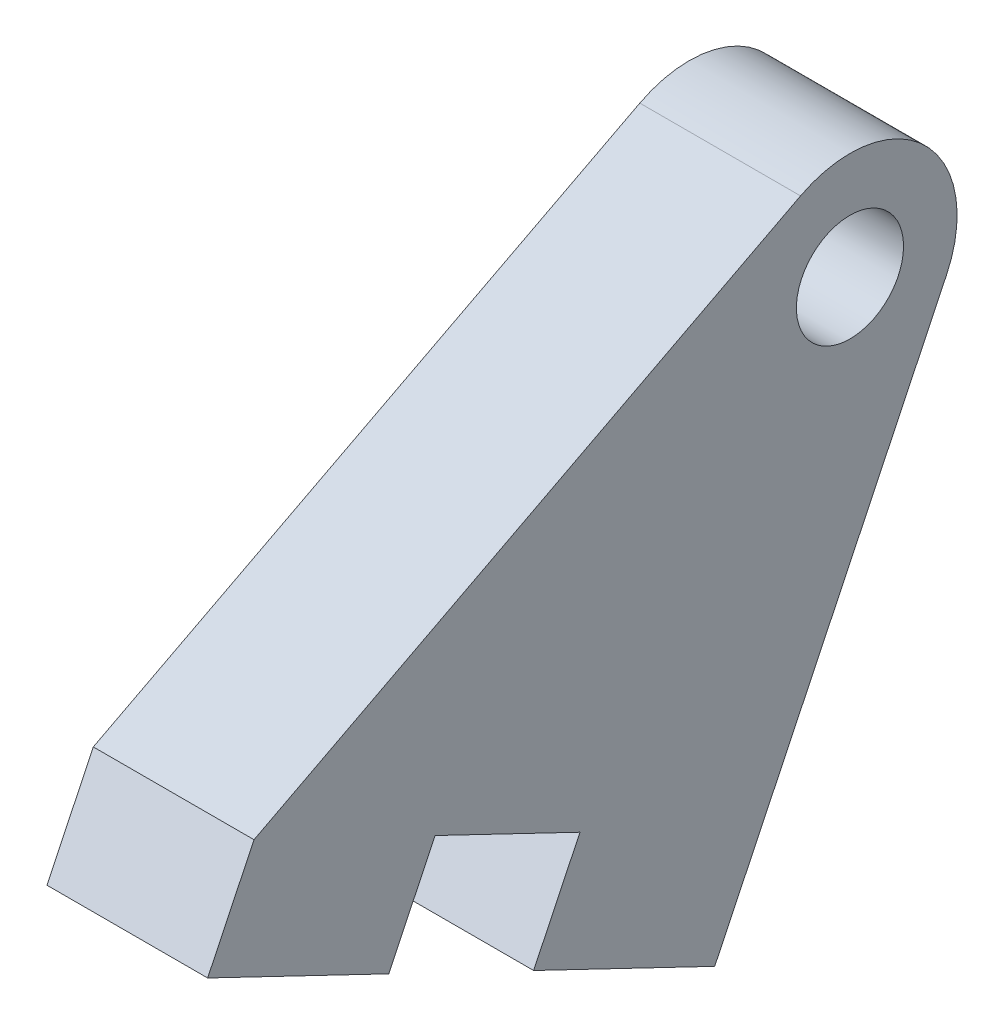
ISO-10303-21;
HEADER;
FILE_DESCRIPTION(('STEP AP214'),'2;1');
FILE_NAME('part.step','',(''),(''),'','','');
FILE_SCHEMA(('AUTOMOTIVE_DESIGN { 1 0 10303 214 1 1 1 1 }'));
ENDSEC;
DATA;
#1=APPLICATION_CONTEXT('core data for automotive mechanical design processes');
#2=APPLICATION_PROTOCOL_DEFINITION('international standard','automotive_design',2000,#1);
#3=PRODUCT_CONTEXT('',#1,'mechanical');
#4=PRODUCT('Part','Part','',(#3));
#5=PRODUCT_RELATED_PRODUCT_CATEGORY('part','',(#4));
#6=PRODUCT_DEFINITION_FORMATION('','',#4);
#7=PRODUCT_DEFINITION_CONTEXT('part definition',#1,'design');
#8=PRODUCT_DEFINITION('design','',#6,#7);
#9=PRODUCT_DEFINITION_SHAPE('','',#8);
#10=(LENGTH_UNIT() NAMED_UNIT(*) SI_UNIT(.MILLI.,.METRE.));
#11=(NAMED_UNIT(*) PLANE_ANGLE_UNIT() SI_UNIT($,.RADIAN.));
#12=(NAMED_UNIT(*) SI_UNIT($,.STERADIAN.) SOLID_ANGLE_UNIT());
#13=UNCERTAINTY_MEASURE_WITH_UNIT(LENGTH_MEASURE(1.E-05),#10,'distance_accuracy_value','');
#14=(GEOMETRIC_REPRESENTATION_CONTEXT(3) GLOBAL_UNCERTAINTY_ASSIGNED_CONTEXT((#13)) GLOBAL_UNIT_ASSIGNED_CONTEXT((#10,
#11,#12)) REPRESENTATION_CONTEXT('',''));
#15=CARTESIAN_POINT('',(0.,0.,0.));
#16=DIRECTION('',(0.,0.,1.));
#17=DIRECTION('',(1.,0.,0.));
#18=AXIS2_PLACEMENT_3D('',#15,#16,#17);
#19=CARTESIAN_POINT('',(1.5,46.5483244603981,24.2151695044081));
#20=DIRECTION('',(0.,-0.887138460295416,-0.461503361054585));
#21=DIRECTION('',(0.,0.461503361054585,-0.887138460295416));
#22=AXIS2_PLACEMENT_3D('',#19,#20,#21);
#23=PLANE('',#22);
#24=DIRECTION('',(0.,-0.461503361054585,0.887138460295416));
#25=VECTOR('',#24,1.);
#26=CARTESIAN_POINT('',(0.,46.5483244603981,24.2151695044081));
#27=LINE('',#26,#25);
#28=CARTESIAN_POINT('',(0.,8.87863013767206,96.6268515014751));
#29=VERTEX_POINT('',#28);
#30=CARTESIAN_POINT('',(0.,6.2249858116082,101.727897648174));
#31=VERTEX_POINT('',#30);
#32=EDGE_CURVE('E141',#29,#31,#27,.T.);
#33=ORIENTED_EDGE('',*,*,#32,.T.);
#34=DIRECTION('',(-1.,0.,0.));
#35=VECTOR('',#34,1.);
#36=CARTESIAN_POINT('',(1.5,6.2249858116082,101.727897648174));
#37=LINE('',#36,#35);
#38=CARTESIAN_POINT('',(1.5,6.2249858116082,101.727897648174));
#39=VERTEX_POINT('',#38);
#40=EDGE_CURVE('E11',#39,#31,#37,.T.);
#41=ORIENTED_EDGE('',*,*,#40,.F.);
#42=DIRECTION('',(0.,-0.461503361054585,0.887138460295416));
#43=VECTOR('',#42,1.);
#44=CARTESIAN_POINT('',(1.5,46.5483244603981,24.2151695044081));
#45=LINE('',#44,#43);
#46=CARTESIAN_POINT('',(1.5,8.87863013767206,96.6268515014751));
#47=VERTEX_POINT('',#46);
#48=EDGE_CURVE('E160',#47,#39,#45,.T.);
#49=ORIENTED_EDGE('',*,*,#48,.F.);
#50=DIRECTION('',(-1.,0.,0.));
#51=VECTOR('',#50,1.);
#52=CARTESIAN_POINT('',(1.5,8.87863013767206,96.6268515014751));
#53=LINE('',#52,#51);
#54=EDGE_CURVE('E140',#47,#29,#53,.T.);
#55=ORIENTED_EDGE('',*,*,#54,.T.);
#56=EDGE_LOOP('',(#33,#41,#49,#55));
#57=FACE_BOUND('',#56,.T.);
#58=ADVANCED_FACE('F35',(#57),#23,.F.);
#59=CARTESIAN_POINT('',(1.5,40.8573538879818,85.1006889069874));
#60=DIRECTION('',(0.,-0.432808751603578,-0.90148576502092));
#61=DIRECTION('',(0.,0.90148576502092,-0.432808751603578));
#62=AXIS2_PLACEMENT_3D('',#59,#60,#61);
#63=PLANE('',#62);
#64=DIRECTION('',(0.,-0.90148576502092,0.432808751603578));
#65=VECTOR('',#64,1.);
#66=CARTESIAN_POINT('',(0.,40.8573538879818,85.1006889069874));
#67=LINE('',#66,#65);
#68=CARTESIAN_POINT('',(0.,5.3235000465873,102.160706399777));
#69=VERTEX_POINT('',#68);
#70=EDGE_CURVE('E144',#31,#69,#67,.T.);
#71=ORIENTED_EDGE('',*,*,#70,.T.);
#72=DIRECTION('',(-1.,0.,0.));
#73=VECTOR('',#72,1.);
#74=CARTESIAN_POINT('',(1.5,5.3235000465873,102.160706399777));
#75=LINE('',#74,#73);
#76=CARTESIAN_POINT('',(1.5,5.3235000465873,102.160706399777));
#77=VERTEX_POINT('',#76);
#78=EDGE_CURVE('E43',#77,#69,#75,.T.);
#79=ORIENTED_EDGE('',*,*,#78,.F.);
#80=DIRECTION('',(0.,-0.90148576502092,0.432808751603578));
#81=VECTOR('',#80,1.);
#82=CARTESIAN_POINT('',(1.5,40.8573538879818,85.1006889069874));
#83=LINE('',#82,#81);
#84=EDGE_CURVE('E97',#39,#77,#83,.T.);
#85=ORIENTED_EDGE('',*,*,#84,.F.);
#86=ORIENTED_EDGE('',*,*,#40,.T.);
#87=EDGE_LOOP('',(#71,#79,#85,#86));
#88=FACE_BOUND('',#87,.T.);
#89=ADVANCED_FACE('F204',(#88),#63,.F.);
#90=CARTESIAN_POINT('',(1.5,-35.533853841395,17.0600174927904));
#91=DIRECTION('',(0.,0.901485765020916,-0.432808751603584));
#92=DIRECTION('',(0.,0.432808751603584,0.901485765020916));
#93=AXIS2_PLACEMENT_3D('',#90,#91,#92);
#94=PLANE('',#93);
#95=DIRECTION('',(0.,-0.432808751603584,-0.901485765020916));
#96=VECTOR('',#95,1.);
#97=CARTESIAN_POINT('',(0.,-35.533853841395,17.0600174927904));
#98=LINE('',#97,#96);
#99=CARTESIAN_POINT('',(0.,4.51198363733057,100.470420590363));
#100=VERTEX_POINT('',#99);
#101=EDGE_CURVE('E146',#69,#100,#98,.T.);
#102=ORIENTED_EDGE('',*,*,#101,.T.);
#103=DIRECTION('',(-1.,0.,0.));
#104=VECTOR('',#103,1.);
#105=CARTESIAN_POINT('',(1.5,4.51198363733057,100.470420590363));
#106=LINE('',#105,#104);
#107=CARTESIAN_POINT('',(1.5,4.51198363733057,100.470420590363));
#108=VERTEX_POINT('',#107);
#109=EDGE_CURVE('E170',#108,#100,#106,.T.);
#110=ORIENTED_EDGE('',*,*,#109,.F.);
#111=DIRECTION('',(0.,-0.432808751603584,-0.901485765020916));
#112=VECTOR('',#111,1.);
#113=CARTESIAN_POINT('',(1.5,-35.533853841395,17.0600174927904));
#114=LINE('',#113,#112);
#115=EDGE_CURVE('E178',#77,#108,#114,.T.);
#116=ORIENTED_EDGE('',*,*,#115,.F.);
#117=ORIENTED_EDGE('',*,*,#78,.T.);
#118=EDGE_LOOP('',(#102,#110,#116,#117));
#119=FACE_BOUND('',#118,.T.);
#120=ADVANCED_FACE('F176',(#119),#94,.F.);
#121=CARTESIAN_POINT('',(1.5,40.0458374787251,83.4104030975731));
#122=DIRECTION('',(0.,0.432808751603579,0.901485765020919));
#123=DIRECTION('',(0.,-0.901485765020919,0.432808751603579));
#124=AXIS2_PLACEMENT_3D('',#121,#122,#123);
#125=PLANE('',#124);
#126=DIRECTION('',(0.,0.901485765020919,-0.432808751603579));
#127=VECTOR('',#126,1.);
#128=CARTESIAN_POINT('',(0.,40.0458374787251,83.4104030975731));
#129=LINE('',#128,#127);
#130=CARTESIAN_POINT('',(0.,5.4134694023515,100.03761183876));
#131=VERTEX_POINT('',#130);
#132=EDGE_CURVE('E148',#100,#131,#129,.T.);
#133=ORIENTED_EDGE('',*,*,#132,.T.);
#134=DIRECTION('',(-1.,0.,0.));
#135=VECTOR('',#134,1.);
#136=CARTESIAN_POINT('',(1.5,5.4134694023515,100.03761183876));
#137=LINE('',#136,#135);
#138=CARTESIAN_POINT('',(1.5,5.4134694023515,100.03761183876));
#139=VERTEX_POINT('',#138);
#140=EDGE_CURVE('E167',#139,#131,#137,.T.);
#141=ORIENTED_EDGE('',*,*,#140,.F.);
#142=DIRECTION('',(0.,0.901485765020919,-0.432808751603579));
#143=VECTOR('',#142,1.);
#144=CARTESIAN_POINT('',(1.5,40.0458374787251,83.4104030975731));
#145=LINE('',#144,#143);
#146=EDGE_CURVE('E195',#108,#139,#145,.T.);
#147=ORIENTED_EDGE('',*,*,#146,.F.);
#148=ORIENTED_EDGE('',*,*,#109,.T.);
#149=EDGE_LOOP('',(#133,#141,#147,#148));
#150=FACE_BOUND('',#149,.T.);
#151=ADVANCED_FACE('F188',(#150),#125,.F.);
#152=CARTESIAN_POINT('',(1.5,-34.6323680763742,16.627208741187));
#153=DIRECTION('',(0.,0.901485765020915,-0.432808751603586));
#154=DIRECTION('',(0.,0.432808751603586,0.901485765020916));
#155=AXIS2_PLACEMENT_3D('',#152,#153,#154);
#156=PLANE('',#155);
#157=DIRECTION('',(0.,-0.432808751603586,-0.901485765020916));
#158=VECTOR('',#157,1.);
#159=CARTESIAN_POINT('',(0.,-34.6323680763742,16.627208741187));
#160=LINE('',#159,#158);
#161=CARTESIAN_POINT('',(0.,4.7642562749461,98.6853831912281));
#162=VERTEX_POINT('',#161);
#163=EDGE_CURVE('E150',#131,#162,#160,.T.);
#164=ORIENTED_EDGE('',*,*,#163,.T.);
#165=DIRECTION('',(-1.,0.,0.));
#166=VECTOR('',#165,1.);
#167=CARTESIAN_POINT('',(1.5,4.7642562749461,98.6853831912281));
#168=LINE('',#167,#166);
#169=CARTESIAN_POINT('',(1.5,4.7642562749461,98.6853831912281));
#170=VERTEX_POINT('',#169);
#171=EDGE_CURVE('E164',#170,#162,#168,.T.);
#172=ORIENTED_EDGE('',*,*,#171,.F.);
#173=DIRECTION('',(0.,-0.432808751603586,-0.901485765020916));
#174=VECTOR('',#173,1.);
#175=CARTESIAN_POINT('',(1.5,-34.6323680763742,16.627208741187));
#176=LINE('',#175,#174);
#177=EDGE_CURVE('E194',#139,#170,#176,.T.);
#178=ORIENTED_EDGE('',*,*,#177,.F.);
#179=ORIENTED_EDGE('',*,*,#140,.T.);
#180=EDGE_LOOP('',(#164,#172,#178,#179));
#181=FACE_BOUND('',#180,.T.);
#182=ADVANCED_FACE('F192',(#181),#156,.F.);
#183=CARTESIAN_POINT('',(1.5,39.3966243513197,82.0581744500419));
#184=DIRECTION('',(0.,-0.432808751603577,-0.90148576502092));
#185=DIRECTION('',(0.,0.90148576502092,-0.432808751603578));
#186=AXIS2_PLACEMENT_3D('',#183,#184,#185);
#187=PLANE('',#186);
#188=DIRECTION('',(0.,-0.90148576502092,0.432808751603577));
#189=VECTOR('',#188,1.);
#190=CARTESIAN_POINT('',(0.,39.3966243513197,82.0581744500419));
#191=LINE('',#190,#189);
#192=CARTESIAN_POINT('',(0.,3.8627705099252,99.1181919428317));
#193=VERTEX_POINT('',#192);
#194=EDGE_CURVE('E152',#162,#193,#191,.T.);
#195=ORIENTED_EDGE('',*,*,#194,.T.);
#196=DIRECTION('',(-1.,0.,0.));
#197=VECTOR('',#196,1.);
#198=CARTESIAN_POINT('',(1.5,3.8627705099252,99.1181919428317));
#199=LINE('',#198,#197);
#200=CARTESIAN_POINT('',(1.5,3.8627705099252,99.1181919428317));
#201=VERTEX_POINT('',#200);
#202=EDGE_CURVE('E129',#201,#193,#199,.T.);
#203=ORIENTED_EDGE('',*,*,#202,.F.);
#204=DIRECTION('',(0.,-0.90148576502092,0.432808751603577));
#205=VECTOR('',#204,1.);
#206=CARTESIAN_POINT('',(1.5,39.3966243513197,82.0581744500419));
#207=LINE('',#206,#205);
#208=EDGE_CURVE('E120',#170,#201,#207,.T.);
#209=ORIENTED_EDGE('',*,*,#208,.F.);
#210=ORIENTED_EDGE('',*,*,#171,.T.);
#211=EDGE_LOOP('',(#195,#203,#209,#210));
#212=FACE_BOUND('',#211,.T.);
#213=ADVANCED_FACE('F216',(#212),#187,.F.);
#214=CARTESIAN_POINT('',(1.5,-35.533853841395,17.0600174927904));
#215=DIRECTION('',(0.,0.901485765020916,-0.432808751603584));
#216=DIRECTION('',(0.,0.432808751603584,0.901485765020916));
#217=AXIS2_PLACEMENT_3D('',#214,#215,#216);
#218=PLANE('',#217);
#219=DIRECTION('',(0.,-0.432808751603584,-0.901485765020916));
#220=VECTOR('',#219,1.);
#221=CARTESIAN_POINT('',(0.,-35.533853841395,17.0600174927904));
#222=LINE('',#221,#220);
#223=CARTESIAN_POINT('',(0.,3.05125410066848,97.4279061334175));
#224=VERTEX_POINT('',#223);
#225=EDGE_CURVE('E128',#193,#224,#222,.T.);
#226=ORIENTED_EDGE('',*,*,#225,.T.);
#227=DIRECTION('',(-1.,0.,0.));
#228=VECTOR('',#227,1.);
#229=CARTESIAN_POINT('',(1.5,3.05125410066848,97.4279061334175));
#230=LINE('',#229,#228);
#231=CARTESIAN_POINT('',(1.5,3.05125410066848,97.4279061334175));
#232=VERTEX_POINT('',#231);
#233=EDGE_CURVE('E125',#232,#224,#230,.T.);
#234=ORIENTED_EDGE('',*,*,#233,.F.);
#235=DIRECTION('',(0.,-0.432808751603584,-0.901485765020916));
#236=VECTOR('',#235,1.);
#237=CARTESIAN_POINT('',(1.5,-35.533853841395,17.0600174927904));
#238=LINE('',#237,#236);
#239=EDGE_CURVE('E113',#201,#232,#238,.T.);
#240=ORIENTED_EDGE('',*,*,#239,.F.);
#241=ORIENTED_EDGE('',*,*,#202,.T.);
#242=EDGE_LOOP('',(#226,#234,#240,#241));
#243=FACE_BOUND('',#242,.T.);
#244=ADVANCED_FACE('F126',(#243),#218,.F.);
#245=CARTESIAN_POINT('',(1.5,38.5851079420635,80.367888640627));
#246=DIRECTION('',(0.,0.432808751603586,0.901485765020915));
#247=DIRECTION('',(0.,-0.901485765020916,0.432808751603586));
#248=AXIS2_PLACEMENT_3D('',#245,#246,#247);
#249=PLANE('',#248);
#250=DIRECTION('',(0.,0.901485765020916,-0.432808751603586));
#251=VECTOR('',#250,1.);
#252=CARTESIAN_POINT('',(0.,38.5851079420635,80.367888640627));
#253=LINE('',#252,#251);
#254=CARTESIAN_POINT('',(0.,7.55868292577306,95.2638623753996));
#255=VERTEX_POINT('',#254);
#256=EDGE_CURVE('E83',#224,#255,#253,.T.);
#257=ORIENTED_EDGE('',*,*,#256,.T.);
#258=DIRECTION('',(-1.,0.,0.));
#259=VECTOR('',#258,1.);
#260=CARTESIAN_POINT('',(1.5,7.55868292577306,95.2638623753996));
#261=LINE('',#260,#259);
#262=CARTESIAN_POINT('',(1.5,7.55868292577306,95.2638623753996));
#263=VERTEX_POINT('',#262);
#264=EDGE_CURVE('E130',#263,#255,#261,.T.);
#265=ORIENTED_EDGE('',*,*,#264,.F.);
#266=DIRECTION('',(0.,0.901485765020916,-0.432808751603586));
#267=VECTOR('',#266,1.);
#268=CARTESIAN_POINT('',(1.5,38.5851079420635,80.367888640627));
#269=LINE('',#268,#267);
#270=EDGE_CURVE('E118',#232,#263,#269,.T.);
#271=ORIENTED_EDGE('',*,*,#270,.F.);
#272=ORIENTED_EDGE('',*,*,#233,.T.);
#273=EDGE_LOOP('',(#257,#265,#271,#272));
#274=FACE_BOUND('',#273,.T.);
#275=ADVANCED_FACE('F132',(#274),#249,.F.);
#276=CARTESIAN_POINT('',(1.5,7.99149167737665,96.1653481404205));
#277=DIRECTION('',(-1.,0.,0.));
#278=DIRECTION('',(0.,0.,1.));
#279=AXIS2_PLACEMENT_3D('',#276,#277,#278);
#280=CYLINDRICAL_SURFACE('',#279,0.999999999999998);
#281=CARTESIAN_POINT('',(0.,7.99149167737665,96.1653481404205));
#282=DIRECTION('',(1.,0.,0.));
#283=DIRECTION('',(0.,0.,-1.));
#284=AXIS2_PLACEMENT_3D('',#281,#282,#283);
#285=CIRCLE('',#284,0.999999999999998);
#286=EDGE_CURVE('E89',#255,#29,#285,.T.);
#287=ORIENTED_EDGE('',*,*,#286,.T.);
#288=ORIENTED_EDGE('',*,*,#54,.F.);
#289=CARTESIAN_POINT('',(1.5,7.99149167737665,96.1653481404205));
#290=DIRECTION('',(1.,0.,0.));
#291=DIRECTION('',(0.,0.,-1.));
#292=AXIS2_PLACEMENT_3D('',#289,#290,#291);
#293=CIRCLE('',#292,0.999999999999998);
#294=EDGE_CURVE('E51',#263,#47,#293,.T.);
#295=ORIENTED_EDGE('',*,*,#294,.F.);
#296=ORIENTED_EDGE('',*,*,#264,.T.);
#297=EDGE_LOOP('',(#287,#288,#295,#296));
#298=FACE_BOUND('',#297,.T.);
#299=ADVANCED_FACE('F224',(#298),#280,.T.);
#300=CARTESIAN_POINT('',(1.5,7.99149167737665,96.1653481404205));
#301=DIRECTION('',(-1.,0.,0.));
#302=DIRECTION('',(0.,0.,1.));
#303=AXIS2_PLACEMENT_3D('',#300,#301,#302);
#304=CYLINDRICAL_SURFACE('',#303,0.499999999999999);
#305=CARTESIAN_POINT('',(1.5,7.99149167737665,96.1653481404205));
#306=DIRECTION('',(1.,0.,0.));
#307=DIRECTION('',(0.,0.,-1.));
#308=AXIS2_PLACEMENT_3D('',#305,#306,#307);
#309=CIRCLE('',#308,0.499999999999999);
#310=CARTESIAN_POINT('',(1.5,7.99149167737665,95.6653481404205));
#311=VERTEX_POINT('',#310);
#312=EDGE_CURVE('E134',#311,#311,#309,.T.);
#313=ORIENTED_EDGE('',*,*,#312,.T.);
#314=EDGE_LOOP('',(#313));
#315=FACE_BOUND('',#314,.T.);
#316=CARTESIAN_POINT('',(0.,7.99149167737665,96.1653481404205));
#317=DIRECTION('',(1.,0.,0.));
#318=DIRECTION('',(0.,0.,-1.));
#319=AXIS2_PLACEMENT_3D('',#316,#317,#318);
#320=CIRCLE('',#319,0.499999999999999);
#321=CARTESIAN_POINT('',(0.,7.99149167737665,95.6653481404205));
#322=VERTEX_POINT('',#321);
#323=EDGE_CURVE('E157',#322,#322,#320,.T.);
#324=ORIENTED_EDGE('',*,*,#323,.F.);
#325=EDGE_LOOP('',(#324));
#326=FACE_BOUND('',#325,.T.);
#327=ADVANCED_FACE('F227',(#315,#326),#304,.F.);
#328=CARTESIAN_POINT('',(1.5,0.,0.));
#329=DIRECTION('',(1.,0.,0.));
#330=DIRECTION('',(0.,0.,-1.));
#331=AXIS2_PLACEMENT_3D('',#328,#329,#330);
#332=PLANE('',#331);
#333=ORIENTED_EDGE('',*,*,#48,.T.);
#334=ORIENTED_EDGE('',*,*,#84,.T.);
#335=ORIENTED_EDGE('',*,*,#115,.T.);
#336=ORIENTED_EDGE('',*,*,#146,.T.);
#337=ORIENTED_EDGE('',*,*,#177,.T.);
#338=ORIENTED_EDGE('',*,*,#208,.T.);
#339=ORIENTED_EDGE('',*,*,#239,.T.);
#340=ORIENTED_EDGE('',*,*,#270,.T.);
#341=ORIENTED_EDGE('',*,*,#294,.T.);
#342=EDGE_LOOP('',(#333,#334,#335,#336,#337,#338,#339,#340,#341));
#343=FACE_BOUND('',#342,.T.);
#344=ORIENTED_EDGE('',*,*,#312,.F.);
#345=EDGE_LOOP('',(#344));
#346=FACE_BOUND('',#345,.T.);
#347=ADVANCED_FACE('F115',(#343,#346),#332,.T.);
#348=CARTESIAN_POINT('',(0.,0.,0.));
#349=DIRECTION('',(1.,0.,0.));
#350=DIRECTION('',(0.,0.,-1.));
#351=AXIS2_PLACEMENT_3D('',#348,#349,#350);
#352=PLANE('',#351);
#353=ORIENTED_EDGE('',*,*,#32,.F.);
#354=ORIENTED_EDGE('',*,*,#286,.F.);
#355=ORIENTED_EDGE('',*,*,#256,.F.);
#356=ORIENTED_EDGE('',*,*,#225,.F.);
#357=ORIENTED_EDGE('',*,*,#194,.F.);
#358=ORIENTED_EDGE('',*,*,#163,.F.);
#359=ORIENTED_EDGE('',*,*,#132,.F.);
#360=ORIENTED_EDGE('',*,*,#101,.F.);
#361=ORIENTED_EDGE('',*,*,#70,.F.);
#362=EDGE_LOOP('',(#353,#354,#355,#356,#357,#358,#359,#360,#361));
#363=FACE_BOUND('',#362,.T.);
#364=ORIENTED_EDGE('',*,*,#323,.T.);
#365=EDGE_LOOP('',(#364));
#366=FACE_BOUND('',#365,.T.);
#367=ADVANCED_FACE('F182',(#363,#366),#352,.F.);
#368=CLOSED_SHELL('',(#58,#89,#120,#151,#182,#213,#244,#275,#299,#327,#347,#367));
#369=MANIFOLD_SOLID_BREP('B2',#368);
#370=ADVANCED_BREP_SHAPE_REPRESENTATION('',(#18,#369),#14);
#371=SHAPE_DEFINITION_REPRESENTATION(#9,#370);
ENDSEC;
END-ISO-10303-21;
